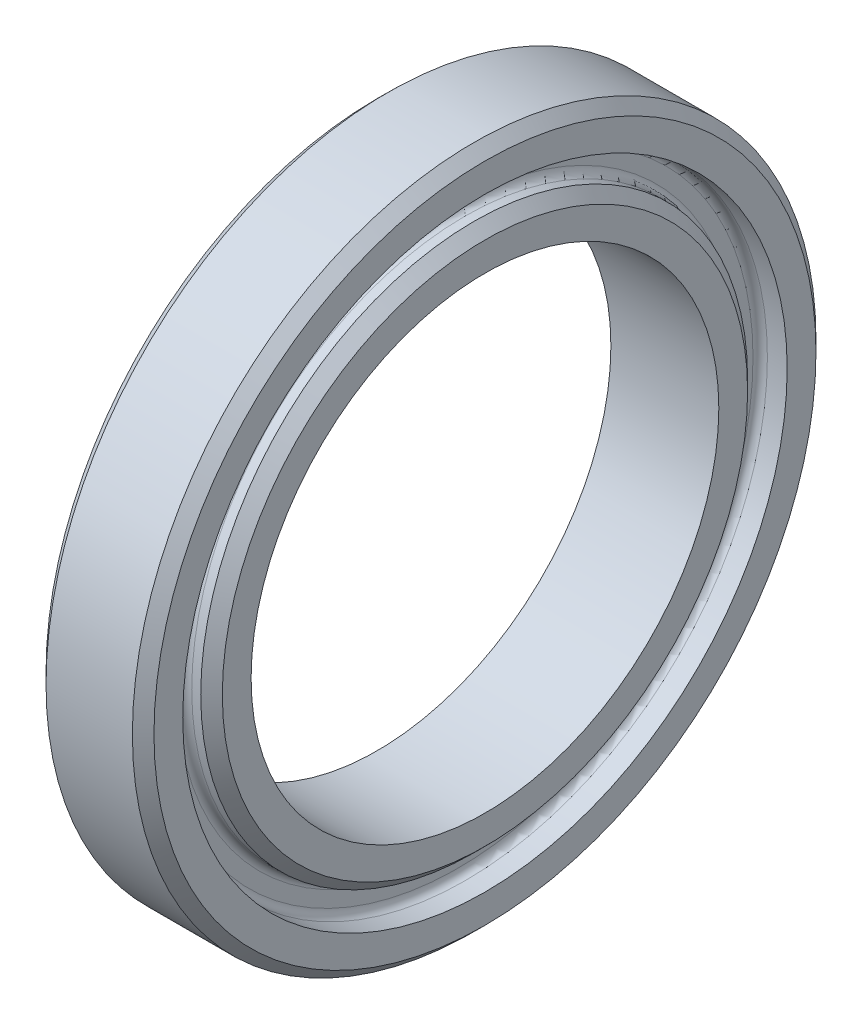
ISO-10303-21;
HEADER;
FILE_DESCRIPTION(('STEP AP214'),'2;1');
FILE_NAME('part.step','',(''),(''),'','','');
FILE_SCHEMA(('AUTOMOTIVE_DESIGN { 1 0 10303 214 1 1 1 1 }'));
ENDSEC;
DATA;
#1=APPLICATION_CONTEXT('core data for automotive mechanical design processes');
#2=APPLICATION_PROTOCOL_DEFINITION('international standard','automotive_design',2000,#1);
#3=PRODUCT_CONTEXT('',#1,'mechanical');
#4=PRODUCT('Part','Part','',(#3));
#5=PRODUCT_RELATED_PRODUCT_CATEGORY('part','',(#4));
#6=PRODUCT_DEFINITION_FORMATION('','',#4);
#7=PRODUCT_DEFINITION_CONTEXT('part definition',#1,'design');
#8=PRODUCT_DEFINITION('design','',#6,#7);
#9=PRODUCT_DEFINITION_SHAPE('','',#8);
#10=(LENGTH_UNIT() NAMED_UNIT(*) SI_UNIT(.MILLI.,.METRE.));
#11=(NAMED_UNIT(*) PLANE_ANGLE_UNIT() SI_UNIT($,.RADIAN.));
#12=(NAMED_UNIT(*) SI_UNIT($,.STERADIAN.) SOLID_ANGLE_UNIT());
#13=UNCERTAINTY_MEASURE_WITH_UNIT(LENGTH_MEASURE(1.E-05),#10,'distance_accuracy_value','');
#14=(GEOMETRIC_REPRESENTATION_CONTEXT(3) GLOBAL_UNCERTAINTY_ASSIGNED_CONTEXT((#13)) GLOBAL_UNIT_ASSIGNED_CONTEXT((#10,
#11,#12)) REPRESENTATION_CONTEXT('',''));
#15=CARTESIAN_POINT('',(0.,0.,0.));
#16=DIRECTION('',(0.,0.,1.));
#17=DIRECTION('',(1.,0.,0.));
#18=AXIS2_PLACEMENT_3D('',#15,#16,#17);
#19=CARTESIAN_POINT('',(0.,0.,0.));
#20=DIRECTION('',(1.,0.,0.));
#21=DIRECTION('',(0.,0.,-1.));
#22=AXIS2_PLACEMENT_3D('',#19,#20,#21);
#23=CYLINDRICAL_SURFACE('',#22,95.);
#24=CARTESIAN_POINT('',(-11.9999999999999,0.,0.));
#25=DIRECTION('',(-1.,0.,0.));
#26=DIRECTION('',(0.,0.,1.));
#27=AXIS2_PLACEMENT_3D('',#24,#25,#26);
#28=CIRCLE('',#27,95.);
#29=CARTESIAN_POINT('',(-11.9999999999999,0.,-95.));
#30=VERTEX_POINT('',#29);
#31=EDGE_CURVE('E56',#30,#30,#28,.F.);
#32=ORIENTED_EDGE('',*,*,#31,.T.);
#33=EDGE_LOOP('',(#32));
#34=FACE_BOUND('',#33,.T.);
#35=CARTESIAN_POINT('',(11.9999999999994,0.,0.));
#36=DIRECTION('',(1.,0.,0.));
#37=DIRECTION('',(0.,0.,-1.));
#38=AXIS2_PLACEMENT_3D('',#35,#36,#37);
#39=CIRCLE('',#38,95.);
#40=CARTESIAN_POINT('',(11.9999999999994,0.,-95.));
#41=VERTEX_POINT('',#40);
#42=EDGE_CURVE('E59',#41,#41,#39,.F.);
#43=ORIENTED_EDGE('',*,*,#42,.T.);
#44=EDGE_LOOP('',(#43));
#45=FACE_BOUND('',#44,.T.);
#46=ADVANCED_FACE('F36',(#34,#45),#23,.T.);
#47=CARTESIAN_POINT('',(-15.,0.,-84.));
#48=DIRECTION('',(-1.,0.,0.));
#49=DIRECTION('',(0.,0.,1.));
#50=AXIS2_PLACEMENT_3D('',#47,#48,#49);
#51=PLANE('',#50);
#52=CARTESIAN_POINT('',(-15.,0.,0.));
#53=DIRECTION('',(-1.,0.,0.));
#54=DIRECTION('',(0.,0.,1.));
#55=AXIS2_PLACEMENT_3D('',#52,#53,#54);
#56=CIRCLE('',#55,91.9999999999999);
#57=CARTESIAN_POINT('',(-15.,0.,-91.9999999999999));
#58=VERTEX_POINT('',#57);
#59=EDGE_CURVE('E51',#58,#58,#56,.T.);
#60=ORIENTED_EDGE('',*,*,#59,.T.);
#61=EDGE_LOOP('',(#60));
#62=FACE_BOUND('',#61,.T.);
#63=CARTESIAN_POINT('',(-15.,0.,0.));
#64=DIRECTION('',(1.,0.,0.));
#65=DIRECTION('',(0.,0.,-1.));
#66=AXIS2_PLACEMENT_3D('',#63,#64,#65);
#67=CIRCLE('',#66,84.);
#68=CARTESIAN_POINT('',(-15.,0.,-84.));
#69=VERTEX_POINT('',#68);
#70=EDGE_CURVE('E86',#69,#69,#67,.T.);
#71=ORIENTED_EDGE('',*,*,#70,.T.);
#72=EDGE_LOOP('',(#71));
#73=FACE_BOUND('',#72,.T.);
#74=ADVANCED_FACE('F119',(#62,#73),#51,.T.);
#75=CARTESIAN_POINT('',(0.,0.,0.));
#76=DIRECTION('',(1.,0.,0.));
#77=DIRECTION('',(0.,0.,-1.));
#78=AXIS2_PLACEMENT_3D('',#75,#76,#77);
#79=CYLINDRICAL_SURFACE('',#78,84.);
#80=CARTESIAN_POINT('',(-9.50000000000006,0.,0.));
#81=DIRECTION('',(-1.,0.,0.));
#82=DIRECTION('',(0.,0.,1.));
#83=AXIS2_PLACEMENT_3D('',#80,#81,#82);
#84=CIRCLE('',#83,84.);
#85=CARTESIAN_POINT('',(-9.50000000000006,0.,84.));
#86=VERTEX_POINT('',#85);
#87=EDGE_CURVE('E83',#86,#86,#84,.F.);
#88=ORIENTED_EDGE('',*,*,#87,.T.);
#89=EDGE_LOOP('',(#88));
#90=FACE_BOUND('',#89,.T.);
#91=ORIENTED_EDGE('',*,*,#70,.F.);
#92=EDGE_LOOP('',(#91));
#93=FACE_BOUND('',#92,.T.);
#94=ADVANCED_FACE('F125',(#90,#93),#79,.F.);
#95=CARTESIAN_POINT('',(-7.50000000000006,0.,-84.));
#96=DIRECTION('',(-1.,0.,0.));
#97=DIRECTION('',(0.,0.,1.));
#98=AXIS2_PLACEMENT_3D('',#95,#96,#97);
#99=PLANE('',#98);
#100=CARTESIAN_POINT('',(-7.50000000000006,0.,0.));
#101=DIRECTION('',(-1.,0.,0.));
#102=DIRECTION('',(0.,0.,1.));
#103=AXIS2_PLACEMENT_3D('',#100,#101,#102);
#104=CIRCLE('',#103,82.);
#105=CARTESIAN_POINT('',(-7.50000000000006,0.,82.));
#106=VERTEX_POINT('',#105);
#107=EDGE_CURVE('E80',#106,#106,#104,.T.);
#108=ORIENTED_EDGE('',*,*,#107,.T.);
#109=EDGE_LOOP('',(#108));
#110=FACE_BOUND('',#109,.T.);
#111=CARTESIAN_POINT('',(-7.50000000000011,0.,0.));
#112=DIRECTION('',(1.,0.,0.));
#113=DIRECTION('',(0.,0.,-1.));
#114=AXIS2_PLACEMENT_3D('',#111,#112,#113);
#115=CIRCLE('',#114,76.);
#116=CARTESIAN_POINT('',(-7.50000000000011,0.,-76.));
#117=VERTEX_POINT('',#116);
#118=EDGE_CURVE('E89',#117,#117,#115,.T.);
#119=ORIENTED_EDGE('',*,*,#118,.T.);
#120=EDGE_LOOP('',(#119));
#121=FACE_BOUND('',#120,.T.);
#122=ADVANCED_FACE('F176',(#110,#121),#99,.T.);
#123=CARTESIAN_POINT('',(0.,0.,0.));
#124=DIRECTION('',(1.,0.,0.));
#125=DIRECTION('',(0.,0.,-1.));
#126=AXIS2_PLACEMENT_3D('',#123,#124,#125);
#127=CYLINDRICAL_SURFACE('',#126,76.);
#128=CARTESIAN_POINT('',(-12.0000000000002,0.,0.));
#129=DIRECTION('',(-1.,0.,0.));
#130=DIRECTION('',(0.,0.,1.));
#131=AXIS2_PLACEMENT_3D('',#128,#129,#130);
#132=CIRCLE('',#131,76.);
#133=CARTESIAN_POINT('',(-12.0000000000002,0.,76.));
#134=VERTEX_POINT('',#133);
#135=EDGE_CURVE('E65',#134,#134,#132,.F.);
#136=ORIENTED_EDGE('',*,*,#135,.T.);
#137=EDGE_LOOP('',(#136));
#138=FACE_BOUND('',#137,.T.);
#139=ORIENTED_EDGE('',*,*,#118,.F.);
#140=EDGE_LOOP('',(#139));
#141=FACE_BOUND('',#140,.T.);
#142=ADVANCED_FACE('F170',(#138,#141),#127,.T.);
#143=CARTESIAN_POINT('',(-15.0000000000002,0.,-65.));
#144=DIRECTION('',(-1.,0.,0.));
#145=DIRECTION('',(0.,0.,1.));
#146=AXIS2_PLACEMENT_3D('',#143,#144,#145);
#147=PLANE('',#146);
#148=CARTESIAN_POINT('',(-15.0000000000002,0.,0.));
#149=DIRECTION('',(-1.,0.,0.));
#150=DIRECTION('',(0.,0.,1.));
#151=AXIS2_PLACEMENT_3D('',#148,#149,#150);
#152=CIRCLE('',#151,72.9999999999999);
#153=CARTESIAN_POINT('',(-15.0000000000002,0.,72.9999999999999));
#154=VERTEX_POINT('',#153);
#155=EDGE_CURVE('E62',#154,#154,#152,.T.);
#156=ORIENTED_EDGE('',*,*,#155,.T.);
#157=EDGE_LOOP('',(#156));
#158=FACE_BOUND('',#157,.T.);
#159=CARTESIAN_POINT('',(-15.0000000000002,0.,0.));
#160=DIRECTION('',(1.,0.,0.));
#161=DIRECTION('',(0.,0.,-1.));
#162=AXIS2_PLACEMENT_3D('',#159,#160,#161);
#163=CIRCLE('',#162,65.);
#164=CARTESIAN_POINT('',(-15.0000000000002,0.,-65.));
#165=VERTEX_POINT('',#164);
#166=EDGE_CURVE('E92',#165,#165,#163,.T.);
#167=ORIENTED_EDGE('',*,*,#166,.T.);
#168=EDGE_LOOP('',(#167));
#169=FACE_BOUND('',#168,.T.);
#170=ADVANCED_FACE('F165',(#158,#169),#147,.T.);
#171=CARTESIAN_POINT('',(0.,0.,0.));
#172=DIRECTION('',(1.,0.,0.));
#173=DIRECTION('',(0.,0.,-1.));
#174=AXIS2_PLACEMENT_3D('',#171,#172,#173);
#175=CYLINDRICAL_SURFACE('',#174,65.0000000000001);
#176=CARTESIAN_POINT('',(14.9999999999998,0.,0.));
#177=DIRECTION('',(1.,0.,0.));
#178=DIRECTION('',(0.,0.,-1.));
#179=AXIS2_PLACEMENT_3D('',#176,#177,#178);
#180=CIRCLE('',#179,65.0000000000001);
#181=CARTESIAN_POINT('',(14.9999999999998,0.,-65.0000000000001));
#182=VERTEX_POINT('',#181);
#183=EDGE_CURVE('E95',#182,#182,#180,.T.);
#184=ORIENTED_EDGE('',*,*,#183,.T.);
#185=EDGE_LOOP('',(#184));
#186=FACE_BOUND('',#185,.T.);
#187=ORIENTED_EDGE('',*,*,#166,.F.);
#188=EDGE_LOOP('',(#187));
#189=FACE_BOUND('',#188,.T.);
#190=ADVANCED_FACE('F159',(#186,#189),#175,.F.);
#191=CARTESIAN_POINT('',(14.9999999999997,0.,-65.0000000000001));
#192=DIRECTION('',(1.,0.,0.));
#193=DIRECTION('',(0.,0.,-1.));
#194=AXIS2_PLACEMENT_3D('',#191,#192,#193);
#195=PLANE('',#194);
#196=CARTESIAN_POINT('',(14.9999999999997,0.,0.));
#197=DIRECTION('',(1.,0.,0.));
#198=DIRECTION('',(0.,0.,-1.));
#199=AXIS2_PLACEMENT_3D('',#196,#197,#198);
#200=CIRCLE('',#199,73.0000000000001);
#201=CARTESIAN_POINT('',(14.9999999999997,0.,-73.0000000000001));
#202=VERTEX_POINT('',#201);
#203=EDGE_CURVE('E47',#202,#202,#200,.T.);
#204=ORIENTED_EDGE('',*,*,#203,.T.);
#205=EDGE_LOOP('',(#204));
#206=FACE_BOUND('',#205,.T.);
#207=ORIENTED_EDGE('',*,*,#183,.F.);
#208=EDGE_LOOP('',(#207));
#209=FACE_BOUND('',#208,.T.);
#210=ADVANCED_FACE('F155',(#206,#209),#195,.T.);
#211=CARTESIAN_POINT('',(0.,0.,0.));
#212=DIRECTION('',(1.,0.,0.));
#213=DIRECTION('',(0.,0.,-1.));
#214=AXIS2_PLACEMENT_3D('',#211,#212,#213);
#215=CYLINDRICAL_SURFACE('',#214,76.0000000000001);
#216=CARTESIAN_POINT('',(11.9999999999997,0.,0.));
#217=DIRECTION('',(1.,0.,0.));
#218=DIRECTION('',(0.,0.,-1.));
#219=AXIS2_PLACEMENT_3D('',#216,#217,#218);
#220=CIRCLE('',#219,76.0000000000001);
#221=CARTESIAN_POINT('',(11.9999999999997,0.,-76.0000000000001));
#222=VERTEX_POINT('',#221);
#223=EDGE_CURVE('E43',#222,#222,#220,.F.);
#224=ORIENTED_EDGE('',*,*,#223,.T.);
#225=EDGE_LOOP('',(#224));
#226=FACE_BOUND('',#225,.T.);
#227=CARTESIAN_POINT('',(9.4999999999995,0.,0.));
#228=DIRECTION('',(1.,0.,0.));
#229=DIRECTION('',(0.,0.,-1.));
#230=AXIS2_PLACEMENT_3D('',#227,#228,#229);
#231=CIRCLE('',#230,76.0000000000001);
#232=CARTESIAN_POINT('',(9.4999999999995,0.,-76.0000000000001));
#233=VERTEX_POINT('',#232);
#234=EDGE_CURVE('E68',#233,#233,#231,.T.);
#235=ORIENTED_EDGE('',*,*,#234,.T.);
#236=EDGE_LOOP('',(#235));
#237=FACE_BOUND('',#236,.T.);
#238=ADVANCED_FACE('F158',(#226,#237),#215,.T.);
#239=CARTESIAN_POINT('',(7.4999999999995,0.,-84.));
#240=DIRECTION('',(1.,0.,0.));
#241=DIRECTION('',(0.,0.,-1.));
#242=AXIS2_PLACEMENT_3D('',#239,#240,#241);
#243=PLANE('',#242);
#244=CARTESIAN_POINT('',(7.4999999999995,0.,0.));
#245=DIRECTION('',(1.,0.,0.));
#246=DIRECTION('',(0.,0.,-1.));
#247=AXIS2_PLACEMENT_3D('',#244,#245,#246);
#248=CIRCLE('',#247,82.0000000000001);
#249=CARTESIAN_POINT('',(7.4999999999995,0.,-82.0000000000001));
#250=VERTEX_POINT('',#249);
#251=EDGE_CURVE('E74',#250,#250,#248,.T.);
#252=ORIENTED_EDGE('',*,*,#251,.T.);
#253=EDGE_LOOP('',(#252));
#254=FACE_BOUND('',#253,.T.);
#255=CARTESIAN_POINT('',(7.4999999999995,0.,0.));
#256=DIRECTION('',(1.,0.,0.));
#257=DIRECTION('',(0.,0.,-1.));
#258=AXIS2_PLACEMENT_3D('',#255,#256,#257);
#259=CIRCLE('',#258,78.0000000000001);
#260=CARTESIAN_POINT('',(7.4999999999995,0.,-78.0000000000001));
#261=VERTEX_POINT('',#260);
#262=EDGE_CURVE('E77',#261,#261,#259,.F.);
#263=ORIENTED_EDGE('',*,*,#262,.T.);
#264=EDGE_LOOP('',(#263));
#265=FACE_BOUND('',#264,.T.);
#266=ADVANCED_FACE('F115',(#254,#265),#243,.T.);
#267=CARTESIAN_POINT('',(0.,0.,0.));
#268=DIRECTION('',(1.,0.,0.));
#269=DIRECTION('',(0.,0.,-1.));
#270=AXIS2_PLACEMENT_3D('',#267,#268,#269);
#271=CYLINDRICAL_SURFACE('',#270,84.0000000000001);
#272=CARTESIAN_POINT('',(9.4999999999995,0.,0.));
#273=DIRECTION('',(1.,0.,0.));
#274=DIRECTION('',(0.,0.,-1.));
#275=AXIS2_PLACEMENT_3D('',#272,#273,#274);
#276=CIRCLE('',#275,84.0000000000001);
#277=CARTESIAN_POINT('',(9.4999999999995,0.,-84.0000000000001));
#278=VERTEX_POINT('',#277);
#279=EDGE_CURVE('E71',#278,#278,#276,.F.);
#280=ORIENTED_EDGE('',*,*,#279,.T.);
#281=EDGE_LOOP('',(#280));
#282=FACE_BOUND('',#281,.T.);
#283=CARTESIAN_POINT('',(14.9999999999994,0.,0.));
#284=DIRECTION('',(1.,0.,0.));
#285=DIRECTION('',(0.,0.,-1.));
#286=AXIS2_PLACEMENT_3D('',#283,#284,#285);
#287=CIRCLE('',#286,84.0000000000001);
#288=CARTESIAN_POINT('',(14.9999999999994,0.,-84.0000000000001));
#289=VERTEX_POINT('',#288);
#290=EDGE_CURVE('E98',#289,#289,#287,.T.);
#291=ORIENTED_EDGE('',*,*,#290,.T.);
#292=EDGE_LOOP('',(#291));
#293=FACE_BOUND('',#292,.T.);
#294=ADVANCED_FACE('F102',(#282,#293),#271,.F.);
#295=CARTESIAN_POINT('',(14.9999999999994,0.,-84.0000000000001));
#296=DIRECTION('',(1.,0.,0.));
#297=DIRECTION('',(0.,0.,-1.));
#298=AXIS2_PLACEMENT_3D('',#295,#296,#297);
#299=PLANE('',#298);
#300=CARTESIAN_POINT('',(14.9999999999994,0.,0.));
#301=DIRECTION('',(1.,0.,0.));
#302=DIRECTION('',(0.,0.,-1.));
#303=AXIS2_PLACEMENT_3D('',#300,#301,#302);
#304=CIRCLE('',#303,92.0000000000001);
#305=CARTESIAN_POINT('',(14.9999999999994,0.,-92.0000000000001));
#306=VERTEX_POINT('',#305);
#307=EDGE_CURVE('E10',#306,#306,#304,.T.);
#308=ORIENTED_EDGE('',*,*,#307,.T.);
#309=EDGE_LOOP('',(#308));
#310=FACE_BOUND('',#309,.T.);
#311=ORIENTED_EDGE('',*,*,#290,.F.);
#312=EDGE_LOOP('',(#311));
#313=FACE_BOUND('',#312,.T.);
#314=ADVANCED_FACE('F104',(#310,#313),#299,.T.);
#315=CARTESIAN_POINT('',(-9.50000000000006,0.,0.));
#316=DIRECTION('',(-1.,0.,0.));
#317=DIRECTION('',(0.,0.,1.));
#318=AXIS2_PLACEMENT_3D('',#315,#316,#317);
#319=TOROIDAL_SURFACE('',#318,82.,2.);
#320=ORIENTED_EDGE('',*,*,#107,.F.);
#321=EDGE_LOOP('',(#320));
#322=FACE_BOUND('',#321,.T.);
#323=ORIENTED_EDGE('',*,*,#87,.F.);
#324=EDGE_LOOP('',(#323));
#325=FACE_BOUND('',#324,.T.);
#326=ADVANCED_FACE('F106',(#322,#325),#319,.F.);
#327=CARTESIAN_POINT('',(9.4999999999995,0.,0.));
#328=DIRECTION('',(1.,0.,0.));
#329=DIRECTION('',(0.,0.,-1.));
#330=AXIS2_PLACEMENT_3D('',#327,#328,#329);
#331=TOROIDAL_SURFACE('',#330,82.0000000000001,2.);
#332=ORIENTED_EDGE('',*,*,#279,.F.);
#333=EDGE_LOOP('',(#332));
#334=FACE_BOUND('',#333,.T.);
#335=ORIENTED_EDGE('',*,*,#251,.F.);
#336=EDGE_LOOP('',(#335));
#337=FACE_BOUND('',#336,.T.);
#338=ADVANCED_FACE('F112',(#334,#337),#331,.F.);
#339=CARTESIAN_POINT('',(9.4999999999995,0.,0.));
#340=DIRECTION('',(1.,0.,0.));
#341=DIRECTION('',(0.,0.,-1.));
#342=AXIS2_PLACEMENT_3D('',#339,#340,#341);
#343=TOROIDAL_SURFACE('',#342,78.0000000000001,2.);
#344=ORIENTED_EDGE('',*,*,#262,.F.);
#345=EDGE_LOOP('',(#344));
#346=FACE_BOUND('',#345,.T.);
#347=ORIENTED_EDGE('',*,*,#234,.F.);
#348=EDGE_LOOP('',(#347));
#349=FACE_BOUND('',#348,.T.);
#350=ADVANCED_FACE('F133',(#346,#349),#343,.F.);
#351=CARTESIAN_POINT('',(-12.0000000000002,0.,0.));
#352=DIRECTION('',(1.,0.,0.));
#353=DIRECTION('',(0.,0.,-1.));
#354=AXIS2_PLACEMENT_3D('',#351,#352,#353);
#355=CONICAL_SURFACE('',#354,76.,0.785398163397453);
#356=ORIENTED_EDGE('',*,*,#155,.F.);
#357=EDGE_LOOP('',(#356));
#358=FACE_BOUND('',#357,.T.);
#359=ORIENTED_EDGE('',*,*,#135,.F.);
#360=EDGE_LOOP('',(#359));
#361=FACE_BOUND('',#360,.T.);
#362=ADVANCED_FACE('F137',(#358,#361),#355,.T.);
#363=CARTESIAN_POINT('',(-11.9999999999999,0.,0.));
#364=DIRECTION('',(1.,0.,0.));
#365=DIRECTION('',(0.,0.,-1.));
#366=AXIS2_PLACEMENT_3D('',#363,#364,#365);
#367=CONICAL_SURFACE('',#366,95.,0.785398163397451);
#368=CARTESIAN_POINT('',(-15.,0.,-91.9999999999999));
#369=CARTESIAN_POINT('',(-14.96875,0.,-92.0312499999999));
#370=CARTESIAN_POINT('',(-14.9375,0.,-92.0624999999999));
#371=CARTESIAN_POINT('',(-14.875,0.,-92.1249999999999));
#372=CARTESIAN_POINT('',(-14.84375,0.,-92.15625));
#373=CARTESIAN_POINT('',(-14.78125,0.,-92.2187499999999));
#374=CARTESIAN_POINT('',(-14.75,0.,-92.25));
#375=CARTESIAN_POINT('',(-14.6875,0.,-92.3124999999999));
#376=CARTESIAN_POINT('',(-14.65625,0.,-92.34375));
#377=CARTESIAN_POINT('',(-14.59375,0.,-92.40625));
#378=CARTESIAN_POINT('',(-14.5625,0.,-92.4375));
#379=CARTESIAN_POINT('',(-14.5,0.,-92.5));
#380=CARTESIAN_POINT('',(-14.46875,0.,-92.53125));
#381=CARTESIAN_POINT('',(-14.40625,0.,-92.59375));
#382=CARTESIAN_POINT('',(-14.375,0.,-92.625));
#383=CARTESIAN_POINT('',(-14.3125,0.,-92.6875));
#384=CARTESIAN_POINT('',(-14.28125,0.,-92.71875));
#385=CARTESIAN_POINT('',(-14.21875,0.,-92.78125));
#386=CARTESIAN_POINT('',(-14.1875,0.,-92.8125));
#387=CARTESIAN_POINT('',(-14.125,0.,-92.875));
#388=CARTESIAN_POINT('',(-14.09375,0.,-92.90625));
#389=CARTESIAN_POINT('',(-14.03125,0.,-92.96875));
#390=CARTESIAN_POINT('',(-14.,0.,-93.));
#391=CARTESIAN_POINT('',(-13.9375,0.,-93.0625));
#392=CARTESIAN_POINT('',(-13.90625,0.,-93.09375));
#393=CARTESIAN_POINT('',(-13.84375,0.,-93.15625));
#394=CARTESIAN_POINT('',(-13.8125,0.,-93.1875));
#395=CARTESIAN_POINT('',(-13.75,0.,-93.25));
#396=CARTESIAN_POINT('',(-13.71875,0.,-93.28125));
#397=CARTESIAN_POINT('',(-13.65625,0.,-93.34375));
#398=CARTESIAN_POINT('',(-13.625,0.,-93.375));
#399=CARTESIAN_POINT('',(-13.5625,0.,-93.4375));
#400=CARTESIAN_POINT('',(-13.53125,0.,-93.46875));
#401=CARTESIAN_POINT('',(-13.46875,0.,-93.53125));
#402=CARTESIAN_POINT('',(-13.4375,0.,-93.5625));
#403=CARTESIAN_POINT('',(-13.375,0.,-93.625));
#404=CARTESIAN_POINT('',(-13.34375,0.,-93.65625));
#405=CARTESIAN_POINT('',(-13.2812499999999,0.,-93.71875));
#406=CARTESIAN_POINT('',(-13.2499999999999,0.,-93.75));
#407=CARTESIAN_POINT('',(-13.1874999999999,0.,-93.8125));
#408=CARTESIAN_POINT('',(-13.1562499999999,0.,-93.84375));
#409=CARTESIAN_POINT('',(-13.0937499999999,0.,-93.90625));
#410=CARTESIAN_POINT('',(-13.0624999999999,0.,-93.9375));
#411=CARTESIAN_POINT('',(-12.9999999999999,0.,-94.));
#412=CARTESIAN_POINT('',(-12.9687499999999,0.,-94.03125));
#413=CARTESIAN_POINT('',(-12.9062499999999,0.,-94.09375));
#414=CARTESIAN_POINT('',(-12.8749999999999,0.,-94.125));
#415=CARTESIAN_POINT('',(-12.8124999999999,0.,-94.1875));
#416=CARTESIAN_POINT('',(-12.7812499999999,0.,-94.21875));
#417=CARTESIAN_POINT('',(-12.7187499999999,0.,-94.28125));
#418=CARTESIAN_POINT('',(-12.6874999999999,0.,-94.3125));
#419=CARTESIAN_POINT('',(-12.6249999999999,0.,-94.375));
#420=CARTESIAN_POINT('',(-12.5937499999999,0.,-94.40625));
#421=CARTESIAN_POINT('',(-12.5312499999999,0.,-94.46875));
#422=CARTESIAN_POINT('',(-12.4999999999999,0.,-94.5));
#423=CARTESIAN_POINT('',(-12.4374999999999,0.,-94.5625));
#424=CARTESIAN_POINT('',(-12.4062499999999,0.,-94.59375));
#425=CARTESIAN_POINT('',(-12.3437499999999,0.,-94.65625));
#426=CARTESIAN_POINT('',(-12.3124999999999,0.,-94.6875));
#427=CARTESIAN_POINT('',(-12.2499999999999,0.,-94.75));
#428=CARTESIAN_POINT('',(-12.2187499999999,0.,-94.78125));
#429=CARTESIAN_POINT('',(-12.1562499999999,0.,-94.84375));
#430=CARTESIAN_POINT('',(-12.1249999999999,0.,-94.875));
#431=CARTESIAN_POINT('',(-12.0624999999999,0.,-94.9375));
#432=CARTESIAN_POINT('',(-12.0312499999999,0.,-94.96875));
#433=CARTESIAN_POINT('',(-11.9999999999999,0.,-95.));
#434=B_SPLINE_CURVE_WITH_KNOTS('',3,(#368,#369,#370,#371,#372,#373,#374,#375,#376,#377,#378,
#379,#380,#381,#382,#383,#384,#385,#386,#387,#388,#389,#390,#391,#392,#393,#394,#395,#396,#397,
#398,#399,#400,#401,#402,#403,#404,#405,#406,#407,#408,#409,#410,#411,#412,#413,#414,#415,#416,
#417,#418,#419,#420,#421,#422,#423,#424,#425,#426,#427,#428,#429,#430,#431,#432,#433),
.UNSPECIFIED.,.F.,.F.,(4,2,2,2,2,2,2,2,2,2,2,2,2,2,2,2,2,2,2,2,2,2,2,2,2,2,2,2,2,2,2,2,4),(0.,
0.132582521472481,0.265165042944964,0.397747564417446,0.530330085889928,0.66291260736241,
0.795495128834892,0.928077650307374,1.06066017177986,1.19324269325234,1.32582521472482,
1.4584077361973,1.59099025766978,1.72357277914227,1.85615530061475,1.98873782208723,
2.12132034355971,2.25390286503219,2.38648538650468,2.51906790797715,2.65165042944963,
2.78423295092211,2.9168154723946,3.04939799386708,3.18198051533956,3.31456303681204,
3.44714555828452,3.57972807975701,3.71231060122949,3.84489312270197,3.97747564417445,
4.11005816564693,4.24264068711942),.UNSPECIFIED.);
#435=EDGE_CURVE('BSEAM141',#58,#30,#434,.T.);
#436=ORIENTED_EDGE('',*,*,#59,.F.);
#437=ORIENTED_EDGE('',*,*,#31,.F.);
#438=ORIENTED_EDGE('',*,*,#435,.T.);
#439=ORIENTED_EDGE('',*,*,#435,.F.);
#440=EDGE_LOOP('',(#436,#438,#437,#439));
#441=FACE_BOUND('',#440,.T.);
#442=ADVANCED_FACE('F141',(#441),#367,.T.);
#443=CARTESIAN_POINT('',(14.9999999999997,0.,0.));
#444=DIRECTION('',(-1.,0.,0.));
#445=DIRECTION('',(0.,0.,1.));
#446=AXIS2_PLACEMENT_3D('',#443,#444,#445);
#447=CONICAL_SURFACE('',#446,73.0000000000001,0.785398163397451);
#448=ORIENTED_EDGE('',*,*,#223,.F.);
#449=EDGE_LOOP('',(#448));
#450=FACE_BOUND('',#449,.T.);
#451=ORIENTED_EDGE('',*,*,#203,.F.);
#452=EDGE_LOOP('',(#451));
#453=FACE_BOUND('',#452,.T.);
#454=ADVANCED_FACE('F144',(#450,#453),#447,.T.);
#455=CARTESIAN_POINT('',(14.9999999999994,0.,0.));
#456=DIRECTION('',(-1.,0.,0.));
#457=DIRECTION('',(0.,0.,1.));
#458=AXIS2_PLACEMENT_3D('',#455,#456,#457);
#459=CONICAL_SURFACE('',#458,92.0000000000001,0.785398163397444);
#460=ORIENTED_EDGE('',*,*,#42,.F.);
#461=EDGE_LOOP('',(#460));
#462=FACE_BOUND('',#461,.T.);
#463=ORIENTED_EDGE('',*,*,#307,.F.);
#464=EDGE_LOOP('',(#463));
#465=FACE_BOUND('',#464,.T.);
#466=ADVANCED_FACE('F38',(#462,#465),#459,.T.);
#467=CLOSED_SHELL('',(#46,#74,#94,#122,#142,#170,#190,#210,#238,#266,#294,#314,#326,#338,#350,
#362,#442,#454,#466));
#468=MANIFOLD_SOLID_BREP('B2',#467);
#469=ADVANCED_BREP_SHAPE_REPRESENTATION('',(#18,#468),#14);
#470=SHAPE_DEFINITION_REPRESENTATION(#9,#469);
ENDSEC;
END-ISO-10303-21;
